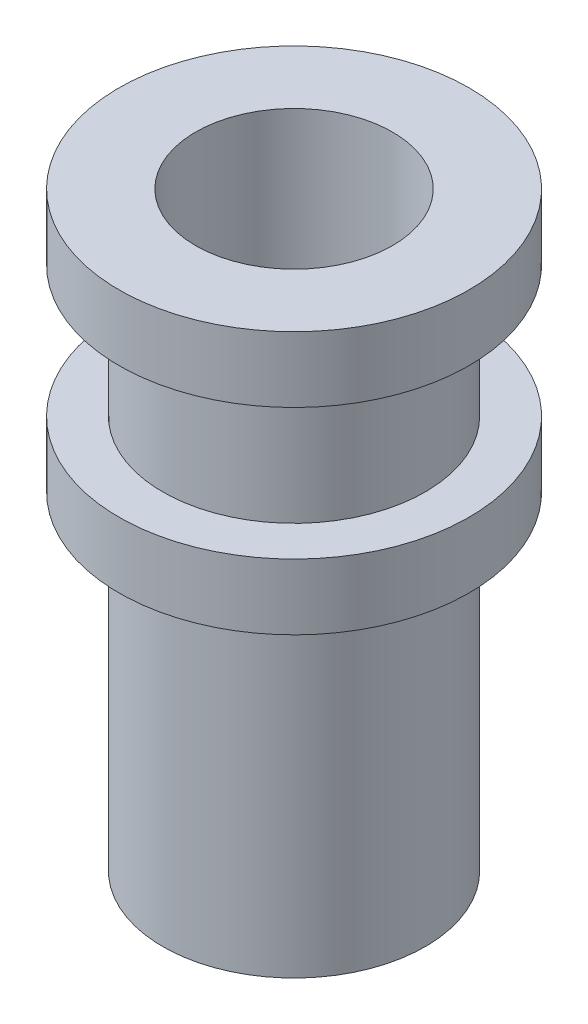
ISO-10303-21;
HEADER;
FILE_DESCRIPTION(('STEP AP214'),'2;1');
FILE_NAME('part.step','',(''),(''),'','','');
FILE_SCHEMA(('AUTOMOTIVE_DESIGN { 1 0 10303 214 1 1 1 1 }'));
ENDSEC;
DATA;
#1=APPLICATION_CONTEXT('core data for automotive mechanical design processes');
#2=APPLICATION_PROTOCOL_DEFINITION('international standard','automotive_design',2000,#1);
#3=PRODUCT_CONTEXT('',#1,'mechanical');
#4=PRODUCT('Part','Part','',(#3));
#5=PRODUCT_RELATED_PRODUCT_CATEGORY('part','',(#4));
#6=PRODUCT_DEFINITION_FORMATION('','',#4);
#7=PRODUCT_DEFINITION_CONTEXT('part definition',#1,'design');
#8=PRODUCT_DEFINITION('design','',#6,#7);
#9=PRODUCT_DEFINITION_SHAPE('','',#8);
#10=(LENGTH_UNIT() NAMED_UNIT(*) SI_UNIT(.MILLI.,.METRE.));
#11=(NAMED_UNIT(*) PLANE_ANGLE_UNIT() SI_UNIT($,.RADIAN.));
#12=(NAMED_UNIT(*) SI_UNIT($,.STERADIAN.) SOLID_ANGLE_UNIT());
#13=UNCERTAINTY_MEASURE_WITH_UNIT(LENGTH_MEASURE(1.E-05),#10,'distance_accuracy_value','');
#14=(GEOMETRIC_REPRESENTATION_CONTEXT(3) GLOBAL_UNCERTAINTY_ASSIGNED_CONTEXT((#13)) GLOBAL_UNIT_ASSIGNED_CONTEXT((#10,
#11,#12)) REPRESENTATION_CONTEXT('',''));
#15=CARTESIAN_POINT('',(0.,0.,0.));
#16=DIRECTION('',(0.,0.,1.));
#17=DIRECTION('',(1.,0.,0.));
#18=AXIS2_PLACEMENT_3D('',#15,#16,#17);
#19=CARTESIAN_POINT('',(0.,14972.865629195,0.));
#20=DIRECTION('',(0.,-1.,0.));
#21=DIRECTION('',(0.,0.,-1.));
#22=AXIS2_PLACEMENT_3D('',#19,#20,#21);
#23=CYLINDRICAL_SURFACE('',#22,900.);
#24=CARTESIAN_POINT('',(0.,3972.86562919504,0.));
#25=DIRECTION('',(0.,1.,0.));
#26=DIRECTION('',(0.,0.,1.));
#27=AXIS2_PLACEMENT_3D('',#24,#25,#26);
#28=CIRCLE('',#27,900.);
#29=CARTESIAN_POINT('',(0.,3972.86562919504,900.));
#30=VERTEX_POINT('',#29);
#31=EDGE_CURVE('E10',#30,#30,#28,.T.);
#32=ORIENTED_EDGE('',*,*,#31,.T.);
#33=EDGE_LOOP('',(#32));
#34=FACE_BOUND('',#33,.T.);
#35=CARTESIAN_POINT('',(0.,-7027.13437080495,0.));
#36=DIRECTION('',(0.,-1.,0.));
#37=DIRECTION('',(0.,0.,-1.));
#38=AXIS2_PLACEMENT_3D('',#35,#36,#37);
#39=CIRCLE('',#38,900.);
#40=CARTESIAN_POINT('',(0.,-7027.13437080495,-900.));
#41=VERTEX_POINT('',#40);
#42=EDGE_CURVE('E73',#41,#41,#39,.T.);
#43=ORIENTED_EDGE('',*,*,#42,.T.);
#44=EDGE_LOOP('',(#43));
#45=FACE_BOUND('',#44,.T.);
#46=ADVANCED_FACE('F31',(#34,#45),#23,.F.);
#47=CARTESIAN_POINT('',(-6000.,-12027.134370805,0.));
#48=DIRECTION('',(0.,1.,0.));
#49=DIRECTION('',(0.,0.,1.));
#50=AXIS2_PLACEMENT_3D('',#47,#48,#49);
#51=PLANE('',#50);
#52=CARTESIAN_POINT('',(0.,-12027.134370805,0.));
#53=DIRECTION('',(0.,-1.,0.));
#54=DIRECTION('',(0.,0.,-1.));
#55=AXIS2_PLACEMENT_3D('',#52,#53,#54);
#56=CIRCLE('',#55,2250.);
#57=CARTESIAN_POINT('',(0.,-12027.134370805,-2250.));
#58=VERTEX_POINT('',#57);
#59=EDGE_CURVE('E70',#58,#58,#56,.T.);
#60=ORIENTED_EDGE('',*,*,#59,.F.);
#61=EDGE_LOOP('',(#60));
#62=FACE_BOUND('',#61,.T.);
#63=CARTESIAN_POINT('',(0.,-12027.134370805,0.));
#64=DIRECTION('',(0.,-1.,0.));
#65=DIRECTION('',(0.,0.,-1.));
#66=AXIS2_PLACEMENT_3D('',#63,#64,#65);
#67=CIRCLE('',#66,6000.);
#68=CARTESIAN_POINT('',(0.,-12027.134370805,-6000.));
#69=VERTEX_POINT('',#68);
#70=EDGE_CURVE('E66',#69,#69,#67,.T.);
#71=ORIENTED_EDGE('',*,*,#70,.T.);
#72=EDGE_LOOP('',(#71));
#73=FACE_BOUND('',#72,.T.);
#74=ADVANCED_FACE('F97',(#62,#73),#51,.F.);
#75=CARTESIAN_POINT('',(0.,14972.865629195,0.));
#76=DIRECTION('',(0.,-1.,0.));
#77=DIRECTION('',(0.,0.,-1.));
#78=AXIS2_PLACEMENT_3D('',#75,#76,#77);
#79=PLANE('',#78);
#80=CARTESIAN_POINT('',(0.,14972.865629195,0.));
#81=DIRECTION('',(0.,1.,0.));
#82=DIRECTION('',(0.,0.,1.));
#83=AXIS2_PLACEMENT_3D('',#80,#81,#82);
#84=CIRCLE('',#83,4500.);
#85=CARTESIAN_POINT('',(0.,14972.865629195,4500.));
#86=VERTEX_POINT('',#85);
#87=EDGE_CURVE('E79',#86,#86,#84,.T.);
#88=ORIENTED_EDGE('',*,*,#87,.F.);
#89=EDGE_LOOP('',(#88));
#90=FACE_BOUND('',#89,.T.);
#91=CARTESIAN_POINT('',(0.,14972.865629195,0.));
#92=DIRECTION('',(0.,-1.,0.));
#93=DIRECTION('',(0.,0.,-1.));
#94=AXIS2_PLACEMENT_3D('',#91,#92,#93);
#95=CIRCLE('',#94,8000.);
#96=CARTESIAN_POINT('',(0.,14972.865629195,-8000.));
#97=VERTEX_POINT('',#96);
#98=EDGE_CURVE('E42',#97,#97,#95,.T.);
#99=ORIENTED_EDGE('',*,*,#98,.F.);
#100=EDGE_LOOP('',(#99));
#101=FACE_BOUND('',#100,.T.);
#102=ADVANCED_FACE('F93',(#90,#101),#79,.F.);
#103=CARTESIAN_POINT('',(0.,0.,0.));
#104=DIRECTION('',(0.,-1.,0.));
#105=DIRECTION('',(0.,0.,-1.));
#106=AXIS2_PLACEMENT_3D('',#103,#104,#105);
#107=CYLINDRICAL_SURFACE('',#106,8000.);
#108=CARTESIAN_POINT('',(0.,11972.865629195,0.));
#109=DIRECTION('',(0.,-1.,0.));
#110=DIRECTION('',(0.,0.,-1.));
#111=AXIS2_PLACEMENT_3D('',#108,#109,#110);
#112=CIRCLE('',#111,8000.);
#113=CARTESIAN_POINT('',(0.,11972.865629195,-8000.));
#114=VERTEX_POINT('',#113);
#115=EDGE_CURVE('E46',#114,#114,#112,.T.);
#116=ORIENTED_EDGE('',*,*,#115,.F.);
#117=EDGE_LOOP('',(#116));
#118=FACE_BOUND('',#117,.T.);
#119=ORIENTED_EDGE('',*,*,#98,.T.);
#120=EDGE_LOOP('',(#119));
#121=FACE_BOUND('',#120,.T.);
#122=ADVANCED_FACE('F96',(#118,#121),#107,.T.);
#123=CARTESIAN_POINT('',(-8000.,11972.865629195,0.));
#124=DIRECTION('',(0.,1.,0.));
#125=DIRECTION('',(0.,0.,1.));
#126=AXIS2_PLACEMENT_3D('',#123,#124,#125);
#127=PLANE('',#126);
#128=CARTESIAN_POINT('',(0.,11972.865629195,0.));
#129=DIRECTION('',(0.,-1.,0.));
#130=DIRECTION('',(0.,0.,-1.));
#131=AXIS2_PLACEMENT_3D('',#128,#129,#130);
#132=CIRCLE('',#131,6000.);
#133=CARTESIAN_POINT('',(0.,11972.865629195,-6000.));
#134=VERTEX_POINT('',#133);
#135=EDGE_CURVE('E51',#134,#134,#132,.T.);
#136=ORIENTED_EDGE('',*,*,#135,.F.);
#137=EDGE_LOOP('',(#136));
#138=FACE_BOUND('',#137,.T.);
#139=ORIENTED_EDGE('',*,*,#115,.T.);
#140=EDGE_LOOP('',(#139));
#141=FACE_BOUND('',#140,.T.);
#142=ADVANCED_FACE('F102',(#138,#141),#127,.F.);
#143=CARTESIAN_POINT('',(0.,0.,0.));
#144=DIRECTION('',(0.,-1.,0.));
#145=DIRECTION('',(0.,0.,-1.));
#146=AXIS2_PLACEMENT_3D('',#143,#144,#145);
#147=CYLINDRICAL_SURFACE('',#146,6000.);
#148=CARTESIAN_POINT('',(0.,5972.86562919505,0.));
#149=DIRECTION('',(0.,-1.,0.));
#150=DIRECTION('',(0.,0.,-1.));
#151=AXIS2_PLACEMENT_3D('',#148,#149,#150);
#152=CIRCLE('',#151,6000.);
#153=CARTESIAN_POINT('',(0.,5972.86562919505,-6000.));
#154=VERTEX_POINT('',#153);
#155=EDGE_CURVE('E54',#154,#154,#152,.T.);
#156=ORIENTED_EDGE('',*,*,#155,.F.);
#157=EDGE_LOOP('',(#156));
#158=FACE_BOUND('',#157,.T.);
#159=ORIENTED_EDGE('',*,*,#135,.T.);
#160=EDGE_LOOP('',(#159));
#161=FACE_BOUND('',#160,.T.);
#162=ADVANCED_FACE('F108',(#158,#161),#147,.T.);
#163=CARTESIAN_POINT('',(-6000.,5972.86562919505,0.));
#164=DIRECTION('',(0.,-1.,0.));
#165=DIRECTION('',(0.,0.,-1.));
#166=AXIS2_PLACEMENT_3D('',#163,#164,#165);
#167=PLANE('',#166);
#168=CARTESIAN_POINT('',(0.,5972.86562919505,0.));
#169=DIRECTION('',(0.,-1.,0.));
#170=DIRECTION('',(0.,0.,-1.));
#171=AXIS2_PLACEMENT_3D('',#168,#169,#170);
#172=CIRCLE('',#171,8000.);
#173=CARTESIAN_POINT('',(0.,5972.86562919505,-8000.));
#174=VERTEX_POINT('',#173);
#175=EDGE_CURVE('E57',#174,#174,#172,.T.);
#176=ORIENTED_EDGE('',*,*,#175,.F.);
#177=EDGE_LOOP('',(#176));
#178=FACE_BOUND('',#177,.T.);
#179=ORIENTED_EDGE('',*,*,#155,.T.);
#180=EDGE_LOOP('',(#179));
#181=FACE_BOUND('',#180,.T.);
#182=ADVANCED_FACE('F140',(#178,#181),#167,.F.);
#183=CARTESIAN_POINT('',(0.,0.,0.));
#184=DIRECTION('',(0.,-1.,0.));
#185=DIRECTION('',(0.,0.,-1.));
#186=AXIS2_PLACEMENT_3D('',#183,#184,#185);
#187=CYLINDRICAL_SURFACE('',#186,8000.);
#188=CARTESIAN_POINT('',(0.,2972.86562919505,0.));
#189=DIRECTION('',(0.,-1.,0.));
#190=DIRECTION('',(0.,0.,-1.));
#191=AXIS2_PLACEMENT_3D('',#188,#189,#190);
#192=CIRCLE('',#191,8000.);
#193=CARTESIAN_POINT('',(0.,2972.86562919505,-8000.));
#194=VERTEX_POINT('',#193);
#195=EDGE_CURVE('E60',#194,#194,#192,.T.);
#196=ORIENTED_EDGE('',*,*,#195,.F.);
#197=EDGE_LOOP('',(#196));
#198=FACE_BOUND('',#197,.T.);
#199=ORIENTED_EDGE('',*,*,#175,.T.);
#200=EDGE_LOOP('',(#199));
#201=FACE_BOUND('',#200,.T.);
#202=ADVANCED_FACE('F136',(#198,#201),#187,.T.);
#203=CARTESIAN_POINT('',(-8000.,2972.86562919505,0.));
#204=DIRECTION('',(0.,1.,0.));
#205=DIRECTION('',(0.,0.,1.));
#206=AXIS2_PLACEMENT_3D('',#203,#204,#205);
#207=PLANE('',#206);
#208=CARTESIAN_POINT('',(0.,2972.86562919505,0.));
#209=DIRECTION('',(0.,-1.,0.));
#210=DIRECTION('',(0.,0.,-1.));
#211=AXIS2_PLACEMENT_3D('',#208,#209,#210);
#212=CIRCLE('',#211,6000.);
#213=CARTESIAN_POINT('',(0.,2972.86562919505,-6000.));
#214=VERTEX_POINT('',#213);
#215=EDGE_CURVE('E63',#214,#214,#212,.T.);
#216=ORIENTED_EDGE('',*,*,#215,.F.);
#217=EDGE_LOOP('',(#216));
#218=FACE_BOUND('',#217,.T.);
#219=ORIENTED_EDGE('',*,*,#195,.T.);
#220=EDGE_LOOP('',(#219));
#221=FACE_BOUND('',#220,.T.);
#222=ADVANCED_FACE('F132',(#218,#221),#207,.F.);
#223=CARTESIAN_POINT('',(0.,0.,0.));
#224=DIRECTION('',(0.,-1.,0.));
#225=DIRECTION('',(0.,0.,-1.));
#226=AXIS2_PLACEMENT_3D('',#223,#224,#225);
#227=CYLINDRICAL_SURFACE('',#226,6000.);
#228=ORIENTED_EDGE('',*,*,#70,.F.);
#229=EDGE_LOOP('',(#228));
#230=FACE_BOUND('',#229,.T.);
#231=ORIENTED_EDGE('',*,*,#215,.T.);
#232=EDGE_LOOP('',(#231));
#233=FACE_BOUND('',#232,.T.);
#234=ADVANCED_FACE('F128',(#230,#233),#227,.T.);
#235=CARTESIAN_POINT('',(0.,-7027.13437080495,0.));
#236=DIRECTION('',(0.,-1.,0.));
#237=DIRECTION('',(0.,0.,-1.));
#238=AXIS2_PLACEMENT_3D('',#235,#236,#237);
#239=CYLINDRICAL_SURFACE('',#238,2250.);
#240=CARTESIAN_POINT('',(0.,-7027.13437080495,0.));
#241=DIRECTION('',(0.,-1.,0.));
#242=DIRECTION('',(0.,0.,-1.));
#243=AXIS2_PLACEMENT_3D('',#240,#241,#242);
#244=CIRCLE('',#243,2250.);
#245=CARTESIAN_POINT('',(0.,-7027.13437080495,-2250.));
#246=VERTEX_POINT('',#245);
#247=EDGE_CURVE('E69',#246,#246,#244,.T.);
#248=ORIENTED_EDGE('',*,*,#247,.F.);
#249=EDGE_LOOP('',(#248));
#250=FACE_BOUND('',#249,.T.);
#251=ORIENTED_EDGE('',*,*,#59,.T.);
#252=EDGE_LOOP('',(#251));
#253=FACE_BOUND('',#252,.T.);
#254=ADVANCED_FACE('F124',(#250,#253),#239,.F.);
#255=CARTESIAN_POINT('',(0.,-7027.13437080495,0.));
#256=DIRECTION('',(0.,-1.,0.));
#257=DIRECTION('',(0.,0.,-1.));
#258=AXIS2_PLACEMENT_3D('',#255,#256,#257);
#259=PLANE('',#258);
#260=ORIENTED_EDGE('',*,*,#42,.F.);
#261=EDGE_LOOP('',(#260));
#262=FACE_BOUND('',#261,.T.);
#263=ORIENTED_EDGE('',*,*,#247,.T.);
#264=EDGE_LOOP('',(#263));
#265=FACE_BOUND('',#264,.T.);
#266=ADVANCED_FACE('F121',(#262,#265),#259,.T.);
#267=CARTESIAN_POINT('',(0.,6972.86562919505,0.));
#268=DIRECTION('',(0.,1.,0.));
#269=DIRECTION('',(0.,0.,1.));
#270=AXIS2_PLACEMENT_3D('',#267,#268,#269);
#271=PLANE('',#270);
#272=CARTESIAN_POINT('',(0.,6972.86562919505,0.));
#273=DIRECTION('',(0.,1.,0.));
#274=DIRECTION('',(0.,0.,1.));
#275=AXIS2_PLACEMENT_3D('',#272,#273,#274);
#276=CIRCLE('',#275,3899.99999999999);
#277=CARTESIAN_POINT('',(0.,6972.86562919505,3899.99999999999));
#278=VERTEX_POINT('',#277);
#279=EDGE_CURVE('E38',#278,#278,#276,.F.);
#280=ORIENTED_EDGE('',*,*,#279,.T.);
#281=EDGE_LOOP('',(#280));
#282=FACE_BOUND('',#281,.T.);
#283=CARTESIAN_POINT('',(0.,6972.86562919505,0.));
#284=DIRECTION('',(0.,1.,0.));
#285=DIRECTION('',(0.,0.,1.));
#286=AXIS2_PLACEMENT_3D('',#283,#284,#285);
#287=CIRCLE('',#286,4500.);
#288=CARTESIAN_POINT('',(0.,6972.86562919505,4500.));
#289=VERTEX_POINT('',#288);
#290=EDGE_CURVE('E78',#289,#289,#287,.T.);
#291=ORIENTED_EDGE('',*,*,#290,.T.);
#292=EDGE_LOOP('',(#291));
#293=FACE_BOUND('',#292,.T.);
#294=ADVANCED_FACE('F85',(#282,#293),#271,.T.);
#295=CARTESIAN_POINT('',(0.,6972.86562919505,0.));
#296=DIRECTION('',(0.,1.,0.));
#297=DIRECTION('',(0.,0.,1.));
#298=AXIS2_PLACEMENT_3D('',#295,#296,#297);
#299=CYLINDRICAL_SURFACE('',#298,4500.);
#300=ORIENTED_EDGE('',*,*,#290,.F.);
#301=EDGE_LOOP('',(#300));
#302=FACE_BOUND('',#301,.T.);
#303=ORIENTED_EDGE('',*,*,#87,.T.);
#304=EDGE_LOOP('',(#303));
#305=FACE_BOUND('',#304,.T.);
#306=ADVANCED_FACE('F87',(#302,#305),#299,.F.);
#307=CARTESIAN_POINT('',(0.,6972.86562919505,0.));
#308=DIRECTION('',(0.,1.,0.));
#309=DIRECTION('',(0.,0.,1.));
#310=AXIS2_PLACEMENT_3D('',#307,#308,#309);
#311=CONICAL_SURFACE('',#310,3899.99999999999,0.785398163397447);
#312=CARTESIAN_POINT('',(0.,3972.86562919504,900.));
#313=CARTESIAN_POINT('',(0.,4004.11562919504,931.25));
#314=CARTESIAN_POINT('',(0.,4035.36562919504,962.5));
#315=CARTESIAN_POINT('',(0.,4097.86562919504,1025.));
#316=CARTESIAN_POINT('',(0.,4129.11562919504,1056.25));
#317=CARTESIAN_POINT('',(0.,4191.61562919504,1118.75));
#318=CARTESIAN_POINT('',(0.,4222.86562919504,1150.));
#319=CARTESIAN_POINT('',(0.,4285.36562919504,1212.5));
#320=CARTESIAN_POINT('',(0.,4316.61562919504,1243.75));
#321=CARTESIAN_POINT('',(0.,4379.11562919504,1306.25));
#322=CARTESIAN_POINT('',(0.,4410.36562919504,1337.5));
#323=CARTESIAN_POINT('',(0.,4472.86562919504,1400.));
#324=CARTESIAN_POINT('',(0.,4504.11562919504,1431.25));
#325=CARTESIAN_POINT('',(0.,4566.61562919504,1493.75));
#326=CARTESIAN_POINT('',(0.,4597.86562919504,1525.));
#327=CARTESIAN_POINT('',(0.,4660.36562919504,1587.5));
#328=CARTESIAN_POINT('',(0.,4691.61562919504,1618.75));
#329=CARTESIAN_POINT('',(0.,4754.11562919504,1681.25));
#330=CARTESIAN_POINT('',(0.,4785.36562919504,1712.5));
#331=CARTESIAN_POINT('',(0.,4847.86562919504,1775.));
#332=CARTESIAN_POINT('',(0.,4879.11562919504,1806.25));
#333=CARTESIAN_POINT('',(0.,4941.61562919504,1868.75));
#334=CARTESIAN_POINT('',(0.,4972.86562919504,1900.));
#335=CARTESIAN_POINT('',(0.,5035.36562919504,1962.5));
#336=CARTESIAN_POINT('',(0.,5066.61562919504,1993.75));
#337=CARTESIAN_POINT('',(0.,5129.11562919504,2056.25));
#338=CARTESIAN_POINT('',(0.,5160.36562919504,2087.5));
#339=CARTESIAN_POINT('',(0.,5222.86562919504,2150.));
#340=CARTESIAN_POINT('',(0.,5254.11562919504,2181.25));
#341=CARTESIAN_POINT('',(0.,5316.61562919504,2243.75));
#342=CARTESIAN_POINT('',(0.,5347.86562919504,2275.));
#343=CARTESIAN_POINT('',(0.,5410.36562919504,2337.5));
#344=CARTESIAN_POINT('',(0.,5441.61562919505,2368.75));
#345=CARTESIAN_POINT('',(0.,5504.11562919505,2431.25));
#346=CARTESIAN_POINT('',(0.,5535.36562919505,2462.5));
#347=CARTESIAN_POINT('',(0.,5597.86562919505,2525.));
#348=CARTESIAN_POINT('',(0.,5629.11562919505,2556.25));
#349=CARTESIAN_POINT('',(0.,5691.61562919505,2618.75));
#350=CARTESIAN_POINT('',(0.,5722.86562919505,2650.));
#351=CARTESIAN_POINT('',(0.,5785.36562919505,2712.5));
#352=CARTESIAN_POINT('',(0.,5816.61562919505,2743.75));
#353=CARTESIAN_POINT('',(0.,5879.11562919505,2806.25));
#354=CARTESIAN_POINT('',(0.,5910.36562919505,2837.5));
#355=CARTESIAN_POINT('',(0.,5972.86562919505,2900.));
#356=CARTESIAN_POINT('',(0.,6004.11562919505,2931.25));
#357=CARTESIAN_POINT('',(0.,6066.61562919505,2993.75));
#358=CARTESIAN_POINT('',(0.,6097.86562919505,3025.));
#359=CARTESIAN_POINT('',(0.,6160.36562919505,3087.5));
#360=CARTESIAN_POINT('',(0.,6191.61562919505,3118.75));
#361=CARTESIAN_POINT('',(0.,6254.11562919505,3181.25));
#362=CARTESIAN_POINT('',(0.,6285.36562919505,3212.5));
#363=CARTESIAN_POINT('',(0.,6347.86562919505,3275.));
#364=CARTESIAN_POINT('',(0.,6379.11562919505,3306.25));
#365=CARTESIAN_POINT('',(0.,6441.61562919505,3368.75));
#366=CARTESIAN_POINT('',(0.,6472.86562919505,3400.));
#367=CARTESIAN_POINT('',(0.,6535.36562919505,3462.5));
#368=CARTESIAN_POINT('',(0.,6566.61562919505,3493.75));
#369=CARTESIAN_POINT('',(0.,6629.11562919505,3556.24999999999));
#370=CARTESIAN_POINT('',(0.,6660.36562919505,3587.49999999999));
#371=CARTESIAN_POINT('',(0.,6722.86562919505,3649.99999999999));
#372=CARTESIAN_POINT('',(0.,6754.11562919505,3681.24999999999));
#373=CARTESIAN_POINT('',(0.,6816.61562919505,3743.74999999999));
#374=CARTESIAN_POINT('',(0.,6847.86562919505,3774.99999999999));
#375=CARTESIAN_POINT('',(0.,6910.36562919505,3837.49999999999));
#376=CARTESIAN_POINT('',(0.,6941.61562919505,3868.74999999999));
#377=CARTESIAN_POINT('',(0.,6972.86562919505,3899.99999999999));
#378=B_SPLINE_CURVE_WITH_KNOTS('',3,(#312,#313,#314,#315,#316,#317,#318,#319,#320,#321,#322,
#323,#324,#325,#326,#327,#328,#329,#330,#331,#332,#333,#334,#335,#336,#337,#338,#339,#340,#341,
#342,#343,#344,#345,#346,#347,#348,#349,#350,#351,#352,#353,#354,#355,#356,#357,#358,#359,#360,
#361,#362,#363,#364,#365,#366,#367,#368,#369,#370,#371,#372,#373,#374,#375,#376,#377),
.UNSPECIFIED.,.F.,.F.,(4,2,2,2,2,2,2,2,2,2,2,2,2,2,2,2,2,2,2,2,2,2,2,2,2,2,2,2,2,2,2,2,4),(0.,
132.582521472478,265.165042944955,397.747564417433,530.33008588991,662.912607362389,
795.495128834866,928.077650307343,1060.66017177982,1193.2426932523,1325.82521472478,
1458.40773619725,1590.99025766973,1723.57277914221,1856.15530061469,1988.73782208716,
2121.32034355964,2253.90286503212,2386.4853865046,2519.06790797708,2651.65042944955,
2784.23295092203,2916.81547239451,3049.39799386699,3181.98051533946,3314.56303681194,
3447.14555828442,3579.7280797569,3712.31060122938,3844.89312270185,3977.47564417433,
4110.05816564681,4242.64068711929),.UNSPECIFIED.);
#379=EDGE_CURVE('BSEAM33',#30,#278,#378,.T.);
#380=ORIENTED_EDGE('',*,*,#31,.F.);
#381=ORIENTED_EDGE('',*,*,#279,.F.);
#382=ORIENTED_EDGE('',*,*,#379,.T.);
#383=ORIENTED_EDGE('',*,*,#379,.F.);
#384=EDGE_LOOP('',(#380,#382,#381,#383));
#385=FACE_BOUND('',#384,.T.);
#386=ADVANCED_FACE('F33',(#385),#311,.F.);
#387=CLOSED_SHELL('',(#46,#74,#102,#122,#142,#162,#182,#202,#222,#234,#254,#266,#294,#306,#386));
#388=MANIFOLD_SOLID_BREP('B2',#387);
#389=ADVANCED_BREP_SHAPE_REPRESENTATION('',(#18,#388),#14);
#390=SHAPE_DEFINITION_REPRESENTATION(#9,#389);
ENDSEC;
END-ISO-10303-21;
